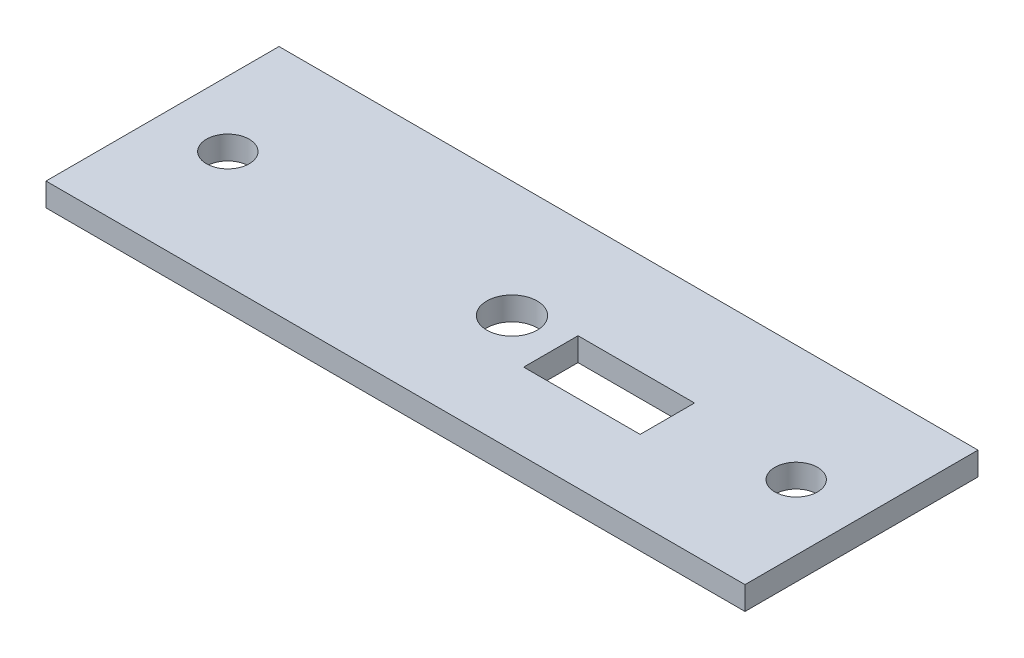
ISO-10303-21;
HEADER;
FILE_DESCRIPTION(('STEP AP214'),'2;1');
FILE_NAME('part.step','',(''),(''),'','','');
FILE_SCHEMA(('AUTOMOTIVE_DESIGN { 1 0 10303 214 1 1 1 1 }'));
ENDSEC;
DATA;
#1=APPLICATION_CONTEXT('core data for automotive mechanical design processes');
#2=APPLICATION_PROTOCOL_DEFINITION('international standard','automotive_design',2000,#1);
#3=PRODUCT_CONTEXT('',#1,'mechanical');
#4=PRODUCT('Part','Part','',(#3));
#5=PRODUCT_RELATED_PRODUCT_CATEGORY('part','',(#4));
#6=PRODUCT_DEFINITION_FORMATION('','',#4);
#7=PRODUCT_DEFINITION_CONTEXT('part definition',#1,'design');
#8=PRODUCT_DEFINITION('design','',#6,#7);
#9=PRODUCT_DEFINITION_SHAPE('','',#8);
#10=(LENGTH_UNIT() NAMED_UNIT(*) SI_UNIT(.MILLI.,.METRE.));
#11=(NAMED_UNIT(*) PLANE_ANGLE_UNIT() SI_UNIT($,.RADIAN.));
#12=(NAMED_UNIT(*) SI_UNIT($,.STERADIAN.) SOLID_ANGLE_UNIT());
#13=UNCERTAINTY_MEASURE_WITH_UNIT(LENGTH_MEASURE(1.E-05),#10,'distance_accuracy_value','');
#14=(GEOMETRIC_REPRESENTATION_CONTEXT(3) GLOBAL_UNCERTAINTY_ASSIGNED_CONTEXT((#13)) GLOBAL_UNIT_ASSIGNED_CONTEXT((#10,
#11,#12)) REPRESENTATION_CONTEXT('',''));
#15=CARTESIAN_POINT('',(0.,0.,0.));
#16=DIRECTION('',(0.,0.,1.));
#17=DIRECTION('',(1.,0.,0.));
#18=AXIS2_PLACEMENT_3D('',#15,#16,#17);
#19=CARTESIAN_POINT('',(45.,3.,0.));
#20=DIRECTION('',(1.,0.,0.));
#21=DIRECTION('',(0.,0.,-1.));
#22=AXIS2_PLACEMENT_3D('',#19,#20,#21);
#23=PLANE('',#22);
#24=DIRECTION('',(0.,0.,1.));
#25=VECTOR('',#24,1.);
#26=CARTESIAN_POINT('',(45.,0.,0.));
#27=LINE('',#26,#25);
#28=CARTESIAN_POINT('',(45.,0.,-15.));
#29=VERTEX_POINT('',#28);
#30=CARTESIAN_POINT('',(45.,0.,15.));
#31=VERTEX_POINT('',#30);
#32=EDGE_CURVE('E175',#29,#31,#27,.T.);
#33=ORIENTED_EDGE('',*,*,#32,.F.);
#34=DIRECTION('',(0.,-1.,0.));
#35=VECTOR('',#34,1.);
#36=CARTESIAN_POINT('',(45.,3.,-15.));
#37=LINE('',#36,#35);
#38=CARTESIAN_POINT('',(45.,3.,-15.));
#39=VERTEX_POINT('',#38);
#40=EDGE_CURVE('E11',#39,#29,#37,.T.);
#41=ORIENTED_EDGE('',*,*,#40,.F.);
#42=DIRECTION('',(0.,0.,1.));
#43=VECTOR('',#42,1.);
#44=CARTESIAN_POINT('',(45.,3.,0.));
#45=LINE('',#44,#43);
#46=CARTESIAN_POINT('',(45.,3.,15.));
#47=VERTEX_POINT('',#46);
#48=EDGE_CURVE('E136',#39,#47,#45,.T.);
#49=ORIENTED_EDGE('',*,*,#48,.T.);
#50=DIRECTION('',(0.,-1.,0.));
#51=VECTOR('',#50,1.);
#52=CARTESIAN_POINT('',(45.,3.,15.));
#53=LINE('',#52,#51);
#54=EDGE_CURVE('E96',#47,#31,#53,.T.);
#55=ORIENTED_EDGE('',*,*,#54,.T.);
#56=EDGE_LOOP('',(#33,#41,#49,#55));
#57=FACE_BOUND('',#56,.T.);
#58=ADVANCED_FACE('F41',(#57),#23,.T.);
#59=CARTESIAN_POINT('',(0.,3.,-15.));
#60=DIRECTION('',(0.,0.,-1.));
#61=DIRECTION('',(-1.,0.,0.));
#62=AXIS2_PLACEMENT_3D('',#59,#60,#61);
#63=PLANE('',#62);
#64=DIRECTION('',(1.,0.,0.));
#65=VECTOR('',#64,1.);
#66=CARTESIAN_POINT('',(0.,0.,-15.));
#67=LINE('',#66,#65);
#68=CARTESIAN_POINT('',(-45.,0.,-15.));
#69=VERTEX_POINT('',#68);
#70=EDGE_CURVE('E124',#69,#29,#67,.T.);
#71=ORIENTED_EDGE('',*,*,#70,.F.);
#72=DIRECTION('',(0.,-1.,0.));
#73=VECTOR('',#72,1.);
#74=CARTESIAN_POINT('',(-45.,3.,-15.));
#75=LINE('',#74,#73);
#76=CARTESIAN_POINT('',(-45.,3.,-15.));
#77=VERTEX_POINT('',#76);
#78=EDGE_CURVE('E52',#77,#69,#75,.T.);
#79=ORIENTED_EDGE('',*,*,#78,.F.);
#80=DIRECTION('',(1.,0.,0.));
#81=VECTOR('',#80,1.);
#82=CARTESIAN_POINT('',(0.,3.,-15.));
#83=LINE('',#82,#81);
#84=EDGE_CURVE('E122',#77,#39,#83,.T.);
#85=ORIENTED_EDGE('',*,*,#84,.T.);
#86=ORIENTED_EDGE('',*,*,#40,.T.);
#87=EDGE_LOOP('',(#71,#79,#85,#86));
#88=FACE_BOUND('',#87,.T.);
#89=ADVANCED_FACE('F120',(#88),#63,.T.);
#90=CARTESIAN_POINT('',(-45.,3.,0.));
#91=DIRECTION('',(1.,0.,0.));
#92=DIRECTION('',(0.,0.,-1.));
#93=AXIS2_PLACEMENT_3D('',#90,#91,#92);
#94=PLANE('',#93);
#95=DIRECTION('',(0.,0.,1.));
#96=VECTOR('',#95,1.);
#97=CARTESIAN_POINT('',(-45.,0.,0.));
#98=LINE('',#97,#96);
#99=CARTESIAN_POINT('',(-45.,0.,15.));
#100=VERTEX_POINT('',#99);
#101=EDGE_CURVE('E180',#69,#100,#98,.T.);
#102=ORIENTED_EDGE('',*,*,#101,.T.);
#103=DIRECTION('',(0.,-1.,0.));
#104=VECTOR('',#103,1.);
#105=CARTESIAN_POINT('',(-45.,3.,15.));
#106=LINE('',#105,#104);
#107=CARTESIAN_POINT('',(-45.,3.,15.));
#108=VERTEX_POINT('',#107);
#109=EDGE_CURVE('E128',#108,#100,#106,.T.);
#110=ORIENTED_EDGE('',*,*,#109,.F.);
#111=DIRECTION('',(0.,0.,1.));
#112=VECTOR('',#111,1.);
#113=CARTESIAN_POINT('',(-45.,3.,0.));
#114=LINE('',#113,#112);
#115=EDGE_CURVE('E131',#77,#108,#114,.T.);
#116=ORIENTED_EDGE('',*,*,#115,.F.);
#117=ORIENTED_EDGE('',*,*,#78,.T.);
#118=EDGE_LOOP('',(#102,#110,#116,#117));
#119=FACE_BOUND('',#118,.T.);
#120=ADVANCED_FACE('F132',(#119),#94,.F.);
#121=CARTESIAN_POINT('',(6.49999999999999,3.,0.));
#122=DIRECTION('',(1.,0.,0.));
#123=DIRECTION('',(0.,0.,-1.));
#124=AXIS2_PLACEMENT_3D('',#121,#122,#123);
#125=PLANE('',#124);
#126=DIRECTION('',(0.,0.,1.));
#127=VECTOR('',#126,1.);
#128=CARTESIAN_POINT('',(6.49999999999999,0.,0.));
#129=LINE('',#128,#127);
#130=CARTESIAN_POINT('',(6.49999999999999,0.,-2.));
#131=VERTEX_POINT('',#130);
#132=CARTESIAN_POINT('',(6.49999999999999,0.,5.));
#133=VERTEX_POINT('',#132);
#134=EDGE_CURVE('E151',#131,#133,#129,.T.);
#135=ORIENTED_EDGE('',*,*,#134,.F.);
#136=DIRECTION('',(0.,-1.,0.));
#137=VECTOR('',#136,1.);
#138=CARTESIAN_POINT('',(6.49999999999999,3.,-2.));
#139=LINE('',#138,#137);
#140=CARTESIAN_POINT('',(6.49999999999999,3.,-2.));
#141=VERTEX_POINT('',#140);
#142=EDGE_CURVE('E45',#141,#131,#139,.T.);
#143=ORIENTED_EDGE('',*,*,#142,.F.);
#144=DIRECTION('',(0.,0.,1.));
#145=VECTOR('',#144,1.);
#146=CARTESIAN_POINT('',(6.49999999999999,3.,0.));
#147=LINE('',#146,#145);
#148=CARTESIAN_POINT('',(6.49999999999999,3.,5.));
#149=VERTEX_POINT('',#148);
#150=EDGE_CURVE('E211',#141,#149,#147,.T.);
#151=ORIENTED_EDGE('',*,*,#150,.T.);
#152=DIRECTION('',(0.,-1.,0.));
#153=VECTOR('',#152,1.);
#154=CARTESIAN_POINT('',(6.49999999999999,3.,5.));
#155=LINE('',#154,#153);
#156=EDGE_CURVE('E146',#149,#133,#155,.T.);
#157=ORIENTED_EDGE('',*,*,#156,.T.);
#158=EDGE_LOOP('',(#135,#143,#151,#157));
#159=FACE_BOUND('',#158,.T.);
#160=ADVANCED_FACE('F210',(#159),#125,.T.);
#161=CARTESIAN_POINT('',(0.,3.,-2.));
#162=DIRECTION('',(0.,0.,-1.));
#163=DIRECTION('',(-1.,0.,0.));
#164=AXIS2_PLACEMENT_3D('',#161,#162,#163);
#165=PLANE('',#164);
#166=DIRECTION('',(1.,0.,0.));
#167=VECTOR('',#166,1.);
#168=CARTESIAN_POINT('',(0.,0.,-2.));
#169=LINE('',#168,#167);
#170=CARTESIAN_POINT('',(21.5,0.,-2.));
#171=VERTEX_POINT('',#170);
#172=EDGE_CURVE('E155',#131,#171,#169,.T.);
#173=ORIENTED_EDGE('',*,*,#172,.T.);
#174=DIRECTION('',(0.,-1.,0.));
#175=VECTOR('',#174,1.);
#176=CARTESIAN_POINT('',(21.5,3.,-2.));
#177=LINE('',#176,#175);
#178=CARTESIAN_POINT('',(21.5,3.,-2.));
#179=VERTEX_POINT('',#178);
#180=EDGE_CURVE('E194',#179,#171,#177,.T.);
#181=ORIENTED_EDGE('',*,*,#180,.F.);
#182=DIRECTION('',(1.,0.,0.));
#183=VECTOR('',#182,1.);
#184=CARTESIAN_POINT('',(0.,3.,-2.));
#185=LINE('',#184,#183);
#186=EDGE_CURVE('E204',#141,#179,#185,.T.);
#187=ORIENTED_EDGE('',*,*,#186,.F.);
#188=ORIENTED_EDGE('',*,*,#142,.T.);
#189=EDGE_LOOP('',(#173,#181,#187,#188));
#190=FACE_BOUND('',#189,.T.);
#191=ADVANCED_FACE('F202',(#190),#165,.F.);
#192=CARTESIAN_POINT('',(21.5,3.,0.));
#193=DIRECTION('',(1.,0.,0.));
#194=DIRECTION('',(0.,0.,-1.));
#195=AXIS2_PLACEMENT_3D('',#192,#193,#194);
#196=PLANE('',#195);
#197=DIRECTION('',(0.,0.,1.));
#198=VECTOR('',#197,1.);
#199=CARTESIAN_POINT('',(21.5,0.,0.));
#200=LINE('',#199,#198);
#201=CARTESIAN_POINT('',(21.5,0.,5.));
#202=VERTEX_POINT('',#201);
#203=EDGE_CURVE('E159',#171,#202,#200,.T.);
#204=ORIENTED_EDGE('',*,*,#203,.T.);
#205=DIRECTION('',(0.,-1.,0.));
#206=VECTOR('',#205,1.);
#207=CARTESIAN_POINT('',(21.5,3.,5.));
#208=LINE('',#207,#206);
#209=CARTESIAN_POINT('',(21.5,3.,5.));
#210=VERTEX_POINT('',#209);
#211=EDGE_CURVE('E192',#210,#202,#208,.T.);
#212=ORIENTED_EDGE('',*,*,#211,.F.);
#213=DIRECTION('',(0.,0.,1.));
#214=VECTOR('',#213,1.);
#215=CARTESIAN_POINT('',(21.5,3.,0.));
#216=LINE('',#215,#214);
#217=EDGE_CURVE('E348',#179,#210,#216,.T.);
#218=ORIENTED_EDGE('',*,*,#217,.F.);
#219=ORIENTED_EDGE('',*,*,#180,.T.);
#220=EDGE_LOOP('',(#204,#212,#218,#219));
#221=FACE_BOUND('',#220,.T.);
#222=ADVANCED_FACE('F218',(#221),#196,.F.);
#223=CARTESIAN_POINT('',(-36.59,3.,0.));
#224=DIRECTION('',(0.,-1.,0.));
#225=DIRECTION('',(0.,0.,-1.));
#226=AXIS2_PLACEMENT_3D('',#223,#224,#225);
#227=CYLINDRICAL_SURFACE('',#226,2.75);
#228=CARTESIAN_POINT('',(-36.59,3.,0.));
#229=DIRECTION('',(0.,1.,0.));
#230=DIRECTION('',(0.,0.,1.));
#231=AXIS2_PLACEMENT_3D('',#228,#229,#230);
#232=CIRCLE('',#231,2.75);
#233=CARTESIAN_POINT('',(-36.59,3.,2.75));
#234=VERTEX_POINT('',#233);
#235=EDGE_CURVE('E140',#234,#234,#232,.T.);
#236=ORIENTED_EDGE('',*,*,#235,.T.);
#237=EDGE_LOOP('',(#236));
#238=FACE_BOUND('',#237,.T.);
#239=CARTESIAN_POINT('',(-36.59,0.,0.));
#240=DIRECTION('',(0.,1.,0.));
#241=DIRECTION('',(0.,0.,1.));
#242=AXIS2_PLACEMENT_3D('',#239,#240,#241);
#243=CIRCLE('',#242,2.75);
#244=CARTESIAN_POINT('',(-36.59,0.,2.75));
#245=VERTEX_POINT('',#244);
#246=EDGE_CURVE('E171',#245,#245,#243,.T.);
#247=ORIENTED_EDGE('',*,*,#246,.F.);
#248=EDGE_LOOP('',(#247));
#249=FACE_BOUND('',#248,.T.);
#250=ADVANCED_FACE('F220',(#238,#249),#227,.F.);
#251=CARTESIAN_POINT('',(0.,3.,0.));
#252=DIRECTION('',(0.,-1.,0.));
#253=DIRECTION('',(0.,0.,-1.));
#254=AXIS2_PLACEMENT_3D('',#251,#252,#253);
#255=CYLINDRICAL_SURFACE('',#254,3.25);
#256=CARTESIAN_POINT('',(0.,3.,0.));
#257=DIRECTION('',(0.,1.,0.));
#258=DIRECTION('',(0.,0.,1.));
#259=AXIS2_PLACEMENT_3D('',#256,#257,#258);
#260=CIRCLE('',#259,3.25);
#261=CARTESIAN_POINT('',(0.,3.,3.25));
#262=VERTEX_POINT('',#261);
#263=EDGE_CURVE('E339',#262,#262,#260,.T.);
#264=ORIENTED_EDGE('',*,*,#263,.T.);
#265=EDGE_LOOP('',(#264));
#266=FACE_BOUND('',#265,.T.);
#267=CARTESIAN_POINT('',(0.,0.,0.));
#268=DIRECTION('',(0.,1.,0.));
#269=DIRECTION('',(0.,0.,1.));
#270=AXIS2_PLACEMENT_3D('',#267,#268,#269);
#271=CIRCLE('',#270,3.25);
#272=CARTESIAN_POINT('',(0.,0.,3.25));
#273=VERTEX_POINT('',#272);
#274=EDGE_CURVE('E167',#273,#273,#271,.T.);
#275=ORIENTED_EDGE('',*,*,#274,.F.);
#276=EDGE_LOOP('',(#275));
#277=FACE_BOUND('',#276,.T.);
#278=ADVANCED_FACE('F226',(#266,#277),#255,.F.);
#279=CARTESIAN_POINT('',(0.,3.,5.));
#280=DIRECTION('',(0.,0.,-1.));
#281=DIRECTION('',(-1.,0.,0.));
#282=AXIS2_PLACEMENT_3D('',#279,#280,#281);
#283=PLANE('',#282);
#284=DIRECTION('',(1.,0.,0.));
#285=VECTOR('',#284,1.);
#286=CARTESIAN_POINT('',(0.,0.,5.));
#287=LINE('',#286,#285);
#288=EDGE_CURVE('E163',#133,#202,#287,.T.);
#289=ORIENTED_EDGE('',*,*,#288,.F.);
#290=ORIENTED_EDGE('',*,*,#156,.F.);
#291=DIRECTION('',(1.,0.,0.));
#292=VECTOR('',#291,1.);
#293=CARTESIAN_POINT('',(0.,3.,5.));
#294=LINE('',#293,#292);
#295=EDGE_CURVE('E216',#149,#210,#294,.T.);
#296=ORIENTED_EDGE('',*,*,#295,.T.);
#297=ORIENTED_EDGE('',*,*,#211,.T.);
#298=EDGE_LOOP('',(#289,#290,#296,#297));
#299=FACE_BOUND('',#298,.T.);
#300=ADVANCED_FACE('F215',(#299),#283,.T.);
#301=CARTESIAN_POINT('',(36.59,3.,0.));
#302=DIRECTION('',(0.,-1.,0.));
#303=DIRECTION('',(0.,0.,-1.));
#304=AXIS2_PLACEMENT_3D('',#301,#302,#303);
#305=CYLINDRICAL_SURFACE('',#304,2.75);
#306=CARTESIAN_POINT('',(36.59,3.,0.));
#307=DIRECTION('',(0.,1.,0.));
#308=DIRECTION('',(0.,0.,1.));
#309=AXIS2_PLACEMENT_3D('',#306,#307,#308);
#310=CIRCLE('',#309,2.75);
#311=CARTESIAN_POINT('',(36.59,3.,2.75));
#312=VERTEX_POINT('',#311);
#313=EDGE_CURVE('E185',#312,#312,#310,.T.);
#314=ORIENTED_EDGE('',*,*,#313,.T.);
#315=EDGE_LOOP('',(#314));
#316=FACE_BOUND('',#315,.T.);
#317=CARTESIAN_POINT('',(36.59,0.,0.));
#318=DIRECTION('',(0.,1.,0.));
#319=DIRECTION('',(0.,0.,1.));
#320=AXIS2_PLACEMENT_3D('',#317,#318,#319);
#321=CIRCLE('',#320,2.75);
#322=CARTESIAN_POINT('',(36.59,0.,2.75));
#323=VERTEX_POINT('',#322);
#324=EDGE_CURVE('E147',#323,#323,#321,.T.);
#325=ORIENTED_EDGE('',*,*,#324,.F.);
#326=EDGE_LOOP('',(#325));
#327=FACE_BOUND('',#326,.T.);
#328=ADVANCED_FACE('F43',(#316,#327),#305,.F.);
#329=CARTESIAN_POINT('',(0.,3.,15.));
#330=DIRECTION('',(0.,0.,-1.));
#331=DIRECTION('',(-1.,0.,0.));
#332=AXIS2_PLACEMENT_3D('',#329,#330,#331);
#333=PLANE('',#332);
#334=DIRECTION('',(1.,0.,0.));
#335=VECTOR('',#334,1.);
#336=CARTESIAN_POINT('',(0.,0.,15.));
#337=LINE('',#336,#335);
#338=EDGE_CURVE('E89',#100,#31,#337,.T.);
#339=ORIENTED_EDGE('',*,*,#338,.T.);
#340=ORIENTED_EDGE('',*,*,#54,.F.);
#341=DIRECTION('',(1.,0.,0.));
#342=VECTOR('',#341,1.);
#343=CARTESIAN_POINT('',(0.,3.,15.));
#344=LINE('',#343,#342);
#345=EDGE_CURVE('E61',#108,#47,#344,.T.);
#346=ORIENTED_EDGE('',*,*,#345,.F.);
#347=ORIENTED_EDGE('',*,*,#109,.T.);
#348=EDGE_LOOP('',(#339,#340,#346,#347));
#349=FACE_BOUND('',#348,.T.);
#350=ADVANCED_FACE('F245',(#349),#333,.F.);
#351=CARTESIAN_POINT('',(0.,3.,0.));
#352=DIRECTION('',(0.,1.,0.));
#353=DIRECTION('',(0.,0.,1.));
#354=AXIS2_PLACEMENT_3D('',#351,#352,#353);
#355=PLANE('',#354);
#356=ORIENTED_EDGE('',*,*,#313,.F.);
#357=EDGE_LOOP('',(#356));
#358=FACE_BOUND('',#357,.T.);
#359=ORIENTED_EDGE('',*,*,#150,.F.);
#360=ORIENTED_EDGE('',*,*,#186,.T.);
#361=ORIENTED_EDGE('',*,*,#217,.T.);
#362=ORIENTED_EDGE('',*,*,#295,.F.);
#363=EDGE_LOOP('',(#359,#360,#361,#362));
#364=FACE_BOUND('',#363,.T.);
#365=ORIENTED_EDGE('',*,*,#263,.F.);
#366=EDGE_LOOP('',(#365));
#367=FACE_BOUND('',#366,.T.);
#368=ORIENTED_EDGE('',*,*,#235,.F.);
#369=EDGE_LOOP('',(#368));
#370=FACE_BOUND('',#369,.T.);
#371=ORIENTED_EDGE('',*,*,#48,.F.);
#372=ORIENTED_EDGE('',*,*,#84,.F.);
#373=ORIENTED_EDGE('',*,*,#115,.T.);
#374=ORIENTED_EDGE('',*,*,#345,.T.);
#375=EDGE_LOOP('',(#371,#372,#373,#374));
#376=FACE_BOUND('',#375,.T.);
#377=ADVANCED_FACE('F135',(#358,#364,#367,#370,#376),#355,.T.);
#378=CARTESIAN_POINT('',(0.,0.,0.));
#379=DIRECTION('',(0.,1.,0.));
#380=DIRECTION('',(0.,0.,1.));
#381=AXIS2_PLACEMENT_3D('',#378,#379,#380);
#382=PLANE('',#381);
#383=ORIENTED_EDGE('',*,*,#324,.T.);
#384=EDGE_LOOP('',(#383));
#385=FACE_BOUND('',#384,.T.);
#386=ORIENTED_EDGE('',*,*,#134,.T.);
#387=ORIENTED_EDGE('',*,*,#288,.T.);
#388=ORIENTED_EDGE('',*,*,#203,.F.);
#389=ORIENTED_EDGE('',*,*,#172,.F.);
#390=EDGE_LOOP('',(#386,#387,#388,#389));
#391=FACE_BOUND('',#390,.T.);
#392=ORIENTED_EDGE('',*,*,#274,.T.);
#393=EDGE_LOOP('',(#392));
#394=FACE_BOUND('',#393,.T.);
#395=ORIENTED_EDGE('',*,*,#246,.T.);
#396=EDGE_LOOP('',(#395));
#397=FACE_BOUND('',#396,.T.);
#398=ORIENTED_EDGE('',*,*,#32,.T.);
#399=ORIENTED_EDGE('',*,*,#338,.F.);
#400=ORIENTED_EDGE('',*,*,#101,.F.);
#401=ORIENTED_EDGE('',*,*,#70,.T.);
#402=EDGE_LOOP('',(#398,#399,#400,#401));
#403=FACE_BOUND('',#402,.T.);
#404=ADVANCED_FACE('F207',(#385,#391,#394,#397,#403),#382,.F.);
#405=CLOSED_SHELL('',(#58,#89,#120,#160,#191,#222,#250,#278,#300,#328,#350,#377,#404));
#406=MANIFOLD_SOLID_BREP('B2',#405);
#407=ADVANCED_BREP_SHAPE_REPRESENTATION('',(#18,#406),#14);
#408=SHAPE_DEFINITION_REPRESENTATION(#9,#407);
ENDSEC;
END-ISO-10303-21;
